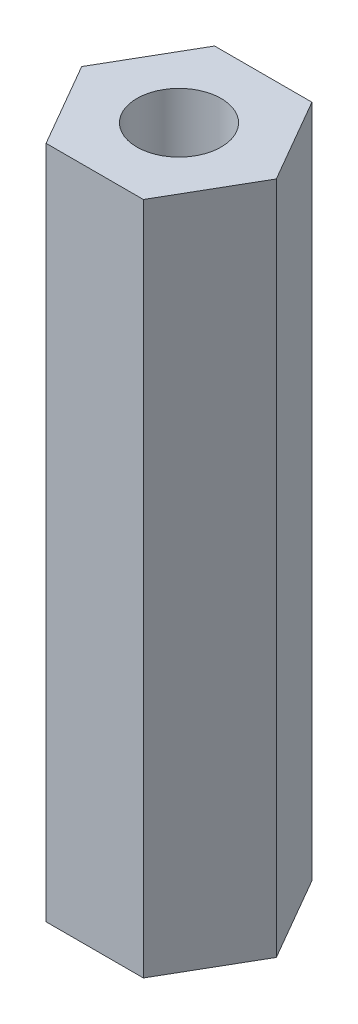
ISO-10303-21;
HEADER;
FILE_DESCRIPTION(('STEP AP214'),'2;1');
FILE_NAME('part.step','',(''),(''),'','','');
FILE_SCHEMA(('AUTOMOTIVE_DESIGN { 1 0 10303 214 1 1 1 1 }'));
ENDSEC;
DATA;
#1=APPLICATION_CONTEXT('core data for automotive mechanical design processes');
#2=APPLICATION_PROTOCOL_DEFINITION('international standard','automotive_design',2000,#1);
#3=PRODUCT_CONTEXT('',#1,'mechanical');
#4=PRODUCT('Part','Part','',(#3));
#5=PRODUCT_RELATED_PRODUCT_CATEGORY('part','',(#4));
#6=PRODUCT_DEFINITION_FORMATION('','',#4);
#7=PRODUCT_DEFINITION_CONTEXT('part definition',#1,'design');
#8=PRODUCT_DEFINITION('design','',#6,#7);
#9=PRODUCT_DEFINITION_SHAPE('','',#8);
#10=(LENGTH_UNIT() NAMED_UNIT(*) SI_UNIT(.MILLI.,.METRE.));
#11=(NAMED_UNIT(*) PLANE_ANGLE_UNIT() SI_UNIT($,.RADIAN.));
#12=(NAMED_UNIT(*) SI_UNIT($,.STERADIAN.) SOLID_ANGLE_UNIT());
#13=UNCERTAINTY_MEASURE_WITH_UNIT(LENGTH_MEASURE(1.E-05),#10,'distance_accuracy_value','');
#14=(GEOMETRIC_REPRESENTATION_CONTEXT(3) GLOBAL_UNCERTAINTY_ASSIGNED_CONTEXT((#13)) GLOBAL_UNIT_ASSIGNED_CONTEXT((#10,
#11,#12)) REPRESENTATION_CONTEXT('',''));
#15=CARTESIAN_POINT('',(0.,0.,0.));
#16=DIRECTION('',(0.,0.,1.));
#17=DIRECTION('',(1.,0.,0.));
#18=AXIS2_PLACEMENT_3D('',#15,#16,#17);
#19=CARTESIAN_POINT('',(0.,50.8,0.));
#20=DIRECTION('',(0.,1.,0.));
#21=DIRECTION('',(0.,0.,1.));
#22=AXIS2_PLACEMENT_3D('',#19,#20,#21);
#23=PLANE('',#22);
#24=DIRECTION('',(0.5,0.,-0.866025403784439));
#25=VECTOR('',#24,1.);
#26=CARTESIAN_POINT('',(3.66617420935413,50.8,6.35));
#27=LINE('',#26,#25);
#28=CARTESIAN_POINT('',(3.66617420935413,50.8,6.35));
#29=VERTEX_POINT('',#28);
#30=CARTESIAN_POINT('',(7.33234841870825,50.8,0.));
#31=VERTEX_POINT('',#30);
#32=EDGE_CURVE('E128',#29,#31,#27,.T.);
#33=ORIENTED_EDGE('',*,*,#32,.T.);
#34=DIRECTION('',(-0.5,0.,-0.866025403784439));
#35=VECTOR('',#34,1.);
#36=CARTESIAN_POINT('',(7.33234841870825,50.8,0.));
#37=LINE('',#36,#35);
#38=CARTESIAN_POINT('',(3.66617420935412,50.8,-6.35000000000001));
#39=VERTEX_POINT('',#38);
#40=EDGE_CURVE('E86',#31,#39,#37,.T.);
#41=ORIENTED_EDGE('',*,*,#40,.T.);
#42=DIRECTION('',(-1.,0.,0.));
#43=VECTOR('',#42,1.);
#44=CARTESIAN_POINT('',(3.66617420935412,50.8,-6.35000000000001));
#45=LINE('',#44,#43);
#46=CARTESIAN_POINT('',(-3.66617420935413,50.8,-6.35000000000001));
#47=VERTEX_POINT('',#46);
#48=EDGE_CURVE('E99',#39,#47,#45,.T.);
#49=ORIENTED_EDGE('',*,*,#48,.T.);
#50=DIRECTION('',(-0.5,0.,0.866025403784439));
#51=VECTOR('',#50,1.);
#52=CARTESIAN_POINT('',(-3.66617420935413,50.8,-6.35000000000001));
#53=LINE('',#52,#51);
#54=CARTESIAN_POINT('',(-7.33234841870825,50.8,0.));
#55=VERTEX_POINT('',#54);
#56=EDGE_CURVE('E93',#47,#55,#53,.T.);
#57=ORIENTED_EDGE('',*,*,#56,.T.);
#58=DIRECTION('',(0.5,0.,0.866025403784439));
#59=VECTOR('',#58,1.);
#60=CARTESIAN_POINT('',(-7.33234841870825,50.8,0.));
#61=LINE('',#60,#59);
#62=CARTESIAN_POINT('',(-3.66617420935413,50.8,6.35000000000001));
#63=VERTEX_POINT('',#62);
#64=EDGE_CURVE('E97',#55,#63,#61,.T.);
#65=ORIENTED_EDGE('',*,*,#64,.T.);
#66=DIRECTION('',(1.,0.,0.));
#67=VECTOR('',#66,1.);
#68=CARTESIAN_POINT('',(-3.66617420935413,50.8,6.35000000000001));
#69=LINE('',#68,#67);
#70=EDGE_CURVE('E49',#63,#29,#69,.T.);
#71=ORIENTED_EDGE('',*,*,#70,.T.);
#72=EDGE_LOOP('',(#33,#41,#49,#57,#65,#71));
#73=FACE_BOUND('',#72,.T.);
#74=CARTESIAN_POINT('',(0.,50.8,0.));
#75=DIRECTION('',(0.,1.,0.));
#76=DIRECTION('',(0.,0.,1.));
#77=AXIS2_PLACEMENT_3D('',#74,#75,#76);
#78=CIRCLE('',#77,3.175);
#79=CARTESIAN_POINT('',(0.,50.8,3.175));
#80=VERTEX_POINT('',#79);
#81=EDGE_CURVE('E121',#80,#80,#78,.T.);
#82=ORIENTED_EDGE('',*,*,#81,.F.);
#83=EDGE_LOOP('',(#82));
#84=FACE_BOUND('',#83,.T.);
#85=ADVANCED_FACE('F32',(#73,#84),#23,.T.);
#86=CARTESIAN_POINT('',(0.,0.,0.));
#87=DIRECTION('',(0.,1.,0.));
#88=DIRECTION('',(0.,0.,1.));
#89=AXIS2_PLACEMENT_3D('',#86,#87,#88);
#90=PLANE('',#89);
#91=DIRECTION('',(0.5,0.,-0.866025403784439));
#92=VECTOR('',#91,1.);
#93=CARTESIAN_POINT('',(3.66617420935413,0.,6.35));
#94=LINE('',#93,#92);
#95=CARTESIAN_POINT('',(3.66617420935413,0.,6.35));
#96=VERTEX_POINT('',#95);
#97=CARTESIAN_POINT('',(7.33234841870825,0.,0.));
#98=VERTEX_POINT('',#97);
#99=EDGE_CURVE('E117',#96,#98,#94,.T.);
#100=ORIENTED_EDGE('',*,*,#99,.F.);
#101=DIRECTION('',(1.,0.,0.));
#102=VECTOR('',#101,1.);
#103=CARTESIAN_POINT('',(-3.66617420935413,0.,6.35000000000001));
#104=LINE('',#103,#102);
#105=CARTESIAN_POINT('',(-3.66617420935413,0.,6.35000000000001));
#106=VERTEX_POINT('',#105);
#107=EDGE_CURVE('E78',#106,#96,#104,.T.);
#108=ORIENTED_EDGE('',*,*,#107,.F.);
#109=DIRECTION('',(0.5,0.,0.866025403784439));
#110=VECTOR('',#109,1.);
#111=CARTESIAN_POINT('',(-7.33234841870825,0.,0.));
#112=LINE('',#111,#110);
#113=CARTESIAN_POINT('',(-7.33234841870825,0.,0.));
#114=VERTEX_POINT('',#113);
#115=EDGE_CURVE('E72',#114,#106,#112,.T.);
#116=ORIENTED_EDGE('',*,*,#115,.F.);
#117=DIRECTION('',(-0.5,0.,0.866025403784439));
#118=VECTOR('',#117,1.);
#119=CARTESIAN_POINT('',(-3.66617420935413,0.,-6.35000000000001));
#120=LINE('',#119,#118);
#121=CARTESIAN_POINT('',(-3.66617420935413,0.,-6.35000000000001));
#122=VERTEX_POINT('',#121);
#123=EDGE_CURVE('E107',#122,#114,#120,.T.);
#124=ORIENTED_EDGE('',*,*,#123,.F.);
#125=DIRECTION('',(-1.,0.,0.));
#126=VECTOR('',#125,1.);
#127=CARTESIAN_POINT('',(3.66617420935412,0.,-6.35000000000001));
#128=LINE('',#127,#126);
#129=CARTESIAN_POINT('',(3.66617420935412,0.,-6.35000000000001));
#130=VERTEX_POINT('',#129);
#131=EDGE_CURVE('E123',#130,#122,#128,.T.);
#132=ORIENTED_EDGE('',*,*,#131,.F.);
#133=DIRECTION('',(-0.5,0.,-0.866025403784439));
#134=VECTOR('',#133,1.);
#135=CARTESIAN_POINT('',(7.33234841870825,0.,0.));
#136=LINE('',#135,#134);
#137=EDGE_CURVE('E120',#98,#130,#136,.T.);
#138=ORIENTED_EDGE('',*,*,#137,.F.);
#139=EDGE_LOOP('',(#100,#108,#116,#124,#132,#138));
#140=FACE_BOUND('',#139,.T.);
#141=CARTESIAN_POINT('',(0.,0.,0.));
#142=DIRECTION('',(0.,1.,0.));
#143=DIRECTION('',(0.,0.,1.));
#144=AXIS2_PLACEMENT_3D('',#141,#142,#143);
#145=CIRCLE('',#144,3.175);
#146=CARTESIAN_POINT('',(0.,0.,3.175));
#147=VERTEX_POINT('',#146);
#148=EDGE_CURVE('E221',#147,#147,#145,.T.);
#149=ORIENTED_EDGE('',*,*,#148,.T.);
#150=EDGE_LOOP('',(#149));
#151=FACE_BOUND('',#150,.T.);
#152=ADVANCED_FACE('F137',(#140,#151),#90,.F.);
#153=CARTESIAN_POINT('',(3.66617420935413,50.8,6.35));
#154=DIRECTION('',(-0.866025403784439,0.,-0.5));
#155=DIRECTION('',(-0.5,0.,0.866025403784439));
#156=AXIS2_PLACEMENT_3D('',#153,#154,#155);
#157=PLANE('',#156);
#158=ORIENTED_EDGE('',*,*,#99,.T.);
#159=DIRECTION('',(0.,-1.,0.));
#160=VECTOR('',#159,1.);
#161=CARTESIAN_POINT('',(7.33234841870825,50.8,0.));
#162=LINE('',#161,#160);
#163=EDGE_CURVE('E11',#31,#98,#162,.T.);
#164=ORIENTED_EDGE('',*,*,#163,.F.);
#165=ORIENTED_EDGE('',*,*,#32,.F.);
#166=DIRECTION('',(0.,-1.,0.));
#167=VECTOR('',#166,1.);
#168=CARTESIAN_POINT('',(3.66617420935413,50.8,6.35));
#169=LINE('',#168,#167);
#170=EDGE_CURVE('E113',#29,#96,#169,.T.);
#171=ORIENTED_EDGE('',*,*,#170,.T.);
#172=EDGE_LOOP('',(#158,#164,#165,#171));
#173=FACE_BOUND('',#172,.T.);
#174=ADVANCED_FACE('F34',(#173),#157,.F.);
#175=CARTESIAN_POINT('',(7.33234841870825,50.8,0.));
#176=DIRECTION('',(-0.866025403784439,0.,0.5));
#177=DIRECTION('',(0.5,0.,0.866025403784439));
#178=AXIS2_PLACEMENT_3D('',#175,#176,#177);
#179=PLANE('',#178);
#180=ORIENTED_EDGE('',*,*,#137,.T.);
#181=DIRECTION('',(0.,-1.,0.));
#182=VECTOR('',#181,1.);
#183=CARTESIAN_POINT('',(3.66617420935412,50.8,-6.35000000000001));
#184=LINE('',#183,#182);
#185=EDGE_CURVE('E41',#39,#130,#184,.T.);
#186=ORIENTED_EDGE('',*,*,#185,.F.);
#187=ORIENTED_EDGE('',*,*,#40,.F.);
#188=ORIENTED_EDGE('',*,*,#163,.T.);
#189=EDGE_LOOP('',(#180,#186,#187,#188));
#190=FACE_BOUND('',#189,.T.);
#191=ADVANCED_FACE('F162',(#190),#179,.F.);
#192=CARTESIAN_POINT('',(3.66617420935412,50.8,-6.35000000000001));
#193=DIRECTION('',(0.,0.,1.));
#194=DIRECTION('',(1.,0.,0.));
#195=AXIS2_PLACEMENT_3D('',#192,#193,#194);
#196=PLANE('',#195);
#197=ORIENTED_EDGE('',*,*,#131,.T.);
#198=DIRECTION('',(0.,-1.,0.));
#199=VECTOR('',#198,1.);
#200=CARTESIAN_POINT('',(-3.66617420935413,50.8,-6.35000000000001));
#201=LINE('',#200,#199);
#202=EDGE_CURVE('E108',#47,#122,#201,.T.);
#203=ORIENTED_EDGE('',*,*,#202,.F.);
#204=ORIENTED_EDGE('',*,*,#48,.F.);
#205=ORIENTED_EDGE('',*,*,#185,.T.);
#206=EDGE_LOOP('',(#197,#203,#204,#205));
#207=FACE_BOUND('',#206,.T.);
#208=ADVANCED_FACE('F134',(#207),#196,.F.);
#209=CARTESIAN_POINT('',(-3.66617420935413,50.8,-6.35000000000001));
#210=DIRECTION('',(0.866025403784439,0.,0.5));
#211=DIRECTION('',(0.5,0.,-0.866025403784439));
#212=AXIS2_PLACEMENT_3D('',#209,#210,#211);
#213=PLANE('',#212);
#214=ORIENTED_EDGE('',*,*,#123,.T.);
#215=DIRECTION('',(0.,-1.,0.));
#216=VECTOR('',#215,1.);
#217=CARTESIAN_POINT('',(-7.33234841870825,50.8,0.));
#218=LINE('',#217,#216);
#219=EDGE_CURVE('E104',#55,#114,#218,.T.);
#220=ORIENTED_EDGE('',*,*,#219,.F.);
#221=ORIENTED_EDGE('',*,*,#56,.F.);
#222=ORIENTED_EDGE('',*,*,#202,.T.);
#223=EDGE_LOOP('',(#214,#220,#221,#222));
#224=FACE_BOUND('',#223,.T.);
#225=ADVANCED_FACE('F105',(#224),#213,.F.);
#226=CARTESIAN_POINT('',(-7.33234841870825,50.8,0.));
#227=DIRECTION('',(0.866025403784439,0.,-0.5));
#228=DIRECTION('',(-0.5,0.,-0.866025403784439));
#229=AXIS2_PLACEMENT_3D('',#226,#227,#228);
#230=PLANE('',#229);
#231=ORIENTED_EDGE('',*,*,#115,.T.);
#232=DIRECTION('',(0.,-1.,0.));
#233=VECTOR('',#232,1.);
#234=CARTESIAN_POINT('',(-3.66617420935413,50.8,6.35000000000001));
#235=LINE('',#234,#233);
#236=EDGE_CURVE('E109',#63,#106,#235,.T.);
#237=ORIENTED_EDGE('',*,*,#236,.F.);
#238=ORIENTED_EDGE('',*,*,#64,.F.);
#239=ORIENTED_EDGE('',*,*,#219,.T.);
#240=EDGE_LOOP('',(#231,#237,#238,#239));
#241=FACE_BOUND('',#240,.T.);
#242=ADVANCED_FACE('F111',(#241),#230,.F.);
#243=CARTESIAN_POINT('',(-3.66617420935413,50.8,6.35000000000001));
#244=DIRECTION('',(0.,0.,-1.));
#245=DIRECTION('',(-1.,0.,0.));
#246=AXIS2_PLACEMENT_3D('',#243,#244,#245);
#247=PLANE('',#246);
#248=ORIENTED_EDGE('',*,*,#107,.T.);
#249=ORIENTED_EDGE('',*,*,#170,.F.);
#250=ORIENTED_EDGE('',*,*,#70,.F.);
#251=ORIENTED_EDGE('',*,*,#236,.T.);
#252=EDGE_LOOP('',(#248,#249,#250,#251));
#253=FACE_BOUND('',#252,.T.);
#254=ADVANCED_FACE('F142',(#253),#247,.F.);
#255=CARTESIAN_POINT('',(0.,50.8,0.));
#256=DIRECTION('',(0.,-1.,0.));
#257=DIRECTION('',(0.,0.,-1.));
#258=AXIS2_PLACEMENT_3D('',#255,#256,#257);
#259=CYLINDRICAL_SURFACE('',#258,3.175);
#260=ORIENTED_EDGE('',*,*,#81,.T.);
#261=EDGE_LOOP('',(#260));
#262=FACE_BOUND('',#261,.T.);
#263=ORIENTED_EDGE('',*,*,#148,.F.);
#264=EDGE_LOOP('',(#263));
#265=FACE_BOUND('',#264,.T.);
#266=ADVANCED_FACE('F144',(#262,#265),#259,.F.);
#267=CLOSED_SHELL('',(#85,#152,#174,#191,#208,#225,#242,#254,#266));
#268=MANIFOLD_SOLID_BREP('B2',#267);
#269=ADVANCED_BREP_SHAPE_REPRESENTATION('',(#18,#268),#14);
#270=SHAPE_DEFINITION_REPRESENTATION(#9,#269);
ENDSEC;
END-ISO-10303-21;
